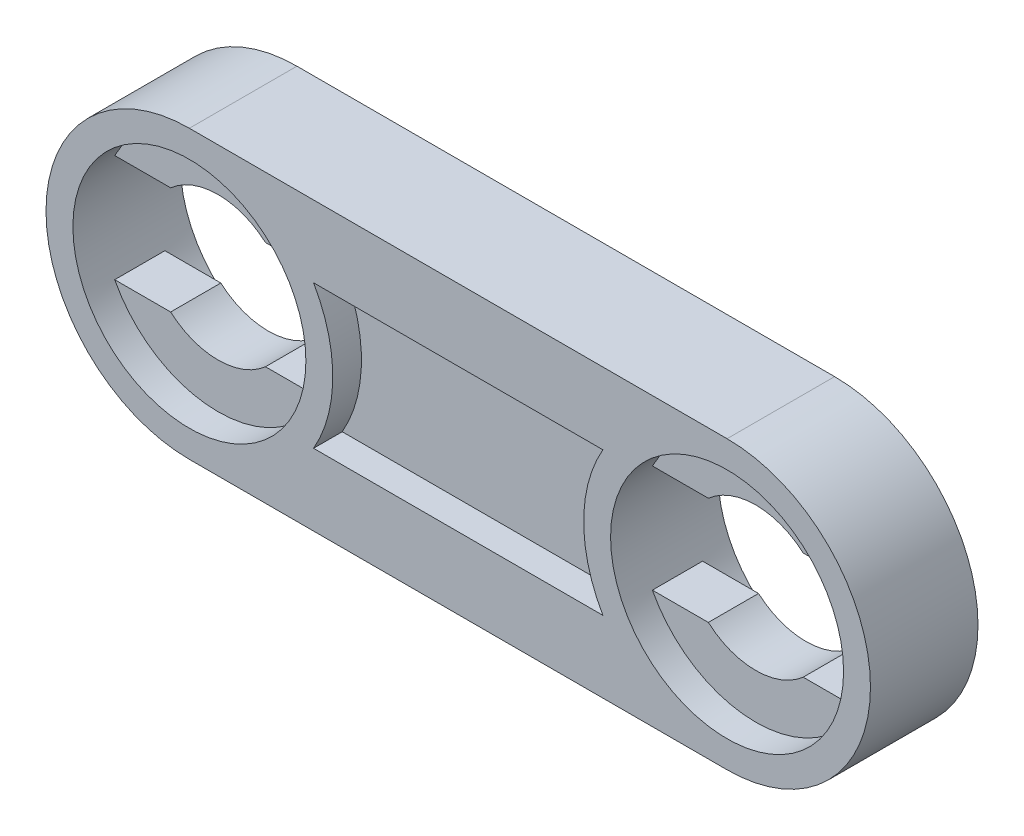
ISO-10303-21;
HEADER;
FILE_DESCRIPTION(('STEP AP214'),'2;1');
FILE_NAME('part.step','',(''),(''),'','','');
FILE_SCHEMA(('AUTOMOTIVE_DESIGN { 1 0 10303 214 1 1 1 1 }'));
ENDSEC;
DATA;
#1=APPLICATION_CONTEXT('core data for automotive mechanical design processes');
#2=APPLICATION_PROTOCOL_DEFINITION('international standard','automotive_design',2000,#1);
#3=PRODUCT_CONTEXT('',#1,'mechanical');
#4=PRODUCT('Part','Part','',(#3));
#5=PRODUCT_RELATED_PRODUCT_CATEGORY('part','',(#4));
#6=PRODUCT_DEFINITION_FORMATION('','',#4);
#7=PRODUCT_DEFINITION_CONTEXT('part definition',#1,'design');
#8=PRODUCT_DEFINITION('design','',#6,#7);
#9=PRODUCT_DEFINITION_SHAPE('','',#8);
#10=(LENGTH_UNIT() NAMED_UNIT(*) SI_UNIT(.MILLI.,.METRE.));
#11=(NAMED_UNIT(*) PLANE_ANGLE_UNIT() SI_UNIT($,.RADIAN.));
#12=(NAMED_UNIT(*) SI_UNIT($,.STERADIAN.) SOLID_ANGLE_UNIT());
#13=UNCERTAINTY_MEASURE_WITH_UNIT(LENGTH_MEASURE(1.E-05),#10,'distance_accuracy_value','');
#14=(GEOMETRIC_REPRESENTATION_CONTEXT(3) GLOBAL_UNCERTAINTY_ASSIGNED_CONTEXT((#13)) GLOBAL_UNIT_ASSIGNED_CONTEXT((#10,
#11,#12)) REPRESENTATION_CONTEXT('',''));
#15=CARTESIAN_POINT('',(0.,0.,0.));
#16=DIRECTION('',(0.,0.,1.));
#17=DIRECTION('',(1.,0.,0.));
#18=AXIS2_PLACEMENT_3D('',#15,#16,#17);
#19=CARTESIAN_POINT('',(0.,0.,0.));
#20=DIRECTION('',(0.,0.,1.));
#21=DIRECTION('',(1.,0.,0.));
#22=AXIS2_PLACEMENT_3D('',#19,#20,#21);
#23=PLANE('',#22);
#24=CARTESIAN_POINT('',(15.,0.,0.));
#25=DIRECTION('',(0.,0.,-1.));
#26=DIRECTION('',(1.,0.,0.));
#27=AXIS2_PLACEMENT_3D('',#24,#25,#26);
#28=CIRCLE('',#27,4.);
#29=CARTESIAN_POINT('',(11.5358983848622,-2.,0.));
#30=VERTEX_POINT('',#29);
#31=CARTESIAN_POINT('',(11.5358983848622,2.,0.));
#32=VERTEX_POINT('',#31);
#33=EDGE_CURVE('E57',#30,#32,#28,.T.);
#34=ORIENTED_EDGE('',*,*,#33,.F.);
#35=DIRECTION('',(1.,0.,0.));
#36=VECTOR('',#35,1.);
#37=CARTESIAN_POINT('',(3.46410161513775,-2.,0.));
#38=LINE('',#37,#36);
#39=CARTESIAN_POINT('',(3.46410161513775,-2.,0.));
#40=VERTEX_POINT('',#39);
#41=EDGE_CURVE('E261',#40,#30,#38,.T.);
#42=ORIENTED_EDGE('',*,*,#41,.F.);
#43=CARTESIAN_POINT('',(0.,0.,0.));
#44=DIRECTION('',(0.,0.,-1.));
#45=DIRECTION('',(1.,0.,0.));
#46=AXIS2_PLACEMENT_3D('',#43,#44,#45);
#47=CIRCLE('',#46,4.);
#48=CARTESIAN_POINT('',(3.46410161513776,2.,0.));
#49=VERTEX_POINT('',#48);
#50=EDGE_CURVE('E275',#49,#40,#47,.T.);
#51=ORIENTED_EDGE('',*,*,#50,.F.);
#52=DIRECTION('',(-1.,0.,0.));
#53=VECTOR('',#52,1.);
#54=CARTESIAN_POINT('',(3.46410161513775,2.,0.));
#55=LINE('',#54,#53);
#56=EDGE_CURVE('E272',#32,#49,#55,.T.);
#57=ORIENTED_EDGE('',*,*,#56,.F.);
#58=EDGE_LOOP('',(#34,#42,#51,#57));
#59=FACE_BOUND('',#58,.T.);
#60=CARTESIAN_POINT('',(0.,0.,0.));
#61=DIRECTION('',(0.,0.,1.));
#62=DIRECTION('',(1.,0.,0.));
#63=AXIS2_PLACEMENT_3D('',#60,#61,#62);
#64=CIRCLE('',#63,4.);
#65=CARTESIAN_POINT('',(0.,4.,0.));
#66=VERTEX_POINT('',#65);
#67=CARTESIAN_POINT('',(0.,-4.,0.));
#68=VERTEX_POINT('',#67);
#69=EDGE_CURVE('E393',#66,#68,#64,.T.);
#70=ORIENTED_EDGE('',*,*,#69,.T.);
#71=DIRECTION('',(1.,0.,0.));
#72=VECTOR('',#71,1.);
#73=CARTESIAN_POINT('',(0.,-4.,0.));
#74=LINE('',#73,#72);
#75=CARTESIAN_POINT('',(15.,-4.,0.));
#76=VERTEX_POINT('',#75);
#77=EDGE_CURVE('E423',#68,#76,#74,.T.);
#78=ORIENTED_EDGE('',*,*,#77,.T.);
#79=CARTESIAN_POINT('',(15.,0.,0.));
#80=DIRECTION('',(0.,0.,1.));
#81=DIRECTION('',(1.,0.,0.));
#82=AXIS2_PLACEMENT_3D('',#79,#80,#81);
#83=CIRCLE('',#82,4.);
#84=CARTESIAN_POINT('',(15.,4.,0.));
#85=VERTEX_POINT('',#84);
#86=EDGE_CURVE('E426',#76,#85,#83,.T.);
#87=ORIENTED_EDGE('',*,*,#86,.T.);
#88=DIRECTION('',(-1.,0.,0.));
#89=VECTOR('',#88,1.);
#90=CARTESIAN_POINT('',(0.,4.,0.));
#91=LINE('',#90,#89);
#92=EDGE_CURVE('E411',#85,#66,#91,.T.);
#93=ORIENTED_EDGE('',*,*,#92,.T.);
#94=EDGE_LOOP('',(#70,#78,#87,#93));
#95=FACE_BOUND('',#94,.T.);
#96=CARTESIAN_POINT('',(0.,0.,0.));
#97=DIRECTION('',(0.,0.,1.));
#98=DIRECTION('',(1.,0.,0.));
#99=AXIS2_PLACEMENT_3D('',#96,#97,#98);
#100=CIRCLE('',#99,3.25);
#101=CARTESIAN_POINT('',(3.25,0.,0.));
#102=VERTEX_POINT('',#101);
#103=EDGE_CURVE('E387',#102,#102,#100,.T.);
#104=ORIENTED_EDGE('',*,*,#103,.F.);
#105=EDGE_LOOP('',(#104));
#106=FACE_BOUND('',#105,.T.);
#107=CARTESIAN_POINT('',(15.,0.,0.));
#108=DIRECTION('',(0.,0.,-1.));
#109=DIRECTION('',(-1.,0.,0.));
#110=AXIS2_PLACEMENT_3D('',#107,#108,#109);
#111=CIRCLE('',#110,3.25);
#112=CARTESIAN_POINT('',(11.75,0.,0.));
#113=VERTEX_POINT('',#112);
#114=EDGE_CURVE('E324',#113,#113,#111,.T.);
#115=ORIENTED_EDGE('',*,*,#114,.T.);
#116=EDGE_LOOP('',(#115));
#117=FACE_BOUND('',#116,.T.);
#118=ADVANCED_FACE('F34',(#59,#95,#106,#117),#23,.T.);
#119=CARTESIAN_POINT('',(17.8831406486677,-1.5,-3.001));
#120=DIRECTION('',(0.,1.,0.));
#121=DIRECTION('',(0.,0.,1.));
#122=AXIS2_PLACEMENT_3D('',#119,#120,#121);
#123=PLANE('',#122);
#124=DIRECTION('',(1.,0.,0.));
#125=VECTOR('',#124,1.);
#126=CARTESIAN_POINT('',(17.8831406486677,-1.5,-2.2));
#127=LINE('',#126,#125);
#128=CARTESIAN_POINT('',(16.3228756555323,-1.5,-2.2));
#129=VERTEX_POINT('',#128);
#130=CARTESIAN_POINT('',(17.8831406486677,-1.5,-2.2));
#131=VERTEX_POINT('',#130);
#132=EDGE_CURVE('E300',#129,#131,#127,.T.);
#133=ORIENTED_EDGE('',*,*,#132,.F.);
#134=DIRECTION('',(0.,0.,1.));
#135=VECTOR('',#134,1.);
#136=CARTESIAN_POINT('',(16.3228756555323,-1.5,-3.001));
#137=LINE('',#136,#135);
#138=CARTESIAN_POINT('',(16.3228756555323,-1.5,-0.8));
#139=VERTEX_POINT('',#138);
#140=EDGE_CURVE('E331',#129,#139,#137,.T.);
#141=ORIENTED_EDGE('',*,*,#140,.T.);
#142=DIRECTION('',(1.,0.,0.));
#143=VECTOR('',#142,1.);
#144=CARTESIAN_POINT('',(17.8831406486677,-1.5,-0.8));
#145=LINE('',#144,#143);
#146=CARTESIAN_POINT('',(17.8831406486677,-1.5,-0.8));
#147=VERTEX_POINT('',#146);
#148=EDGE_CURVE('E318',#139,#147,#145,.T.);
#149=ORIENTED_EDGE('',*,*,#148,.T.);
#150=DIRECTION('',(0.,0.,1.));
#151=VECTOR('',#150,1.);
#152=CARTESIAN_POINT('',(17.8831406486677,-1.5,-3.001));
#153=LINE('',#152,#151);
#154=EDGE_CURVE('E328',#131,#147,#153,.T.);
#155=ORIENTED_EDGE('',*,*,#154,.F.);
#156=EDGE_LOOP('',(#133,#141,#149,#155));
#157=FACE_BOUND('',#156,.T.);
#158=ADVANCED_FACE('F476',(#157),#123,.T.);
#159=CARTESIAN_POINT('',(15.,0.,-3.001));
#160=DIRECTION('',(0.,0.,1.));
#161=DIRECTION('',(1.,0.,0.));
#162=AXIS2_PLACEMENT_3D('',#159,#160,#161);
#163=CYLINDRICAL_SURFACE('',#162,2.);
#164=CARTESIAN_POINT('',(15.,0.,-2.2));
#165=DIRECTION('',(0.,0.,1.));
#166=DIRECTION('',(1.,0.,0.));
#167=AXIS2_PLACEMENT_3D('',#164,#165,#166);
#168=CIRCLE('',#167,2.);
#169=CARTESIAN_POINT('',(13.6771243444677,-1.5,-2.2));
#170=VERTEX_POINT('',#169);
#171=EDGE_CURVE('E298',#170,#129,#168,.T.);
#172=ORIENTED_EDGE('',*,*,#171,.F.);
#173=DIRECTION('',(0.,0.,1.));
#174=VECTOR('',#173,1.);
#175=CARTESIAN_POINT('',(13.6771243444677,-1.5,-3.001));
#176=LINE('',#175,#174);
#177=CARTESIAN_POINT('',(13.6771243444677,-1.5,-0.800000000000001));
#178=VERTEX_POINT('',#177);
#179=EDGE_CURVE('E333',#170,#178,#176,.T.);
#180=ORIENTED_EDGE('',*,*,#179,.T.);
#181=CARTESIAN_POINT('',(15.,0.,-0.8));
#182=DIRECTION('',(0.,0.,1.));
#183=DIRECTION('',(1.,0.,0.));
#184=AXIS2_PLACEMENT_3D('',#181,#182,#183);
#185=CIRCLE('',#184,2.);
#186=EDGE_CURVE('E315',#178,#139,#185,.T.);
#187=ORIENTED_EDGE('',*,*,#186,.T.);
#188=ORIENTED_EDGE('',*,*,#140,.F.);
#189=EDGE_LOOP('',(#172,#180,#187,#188));
#190=FACE_BOUND('',#189,.T.);
#191=ADVANCED_FACE('F482',(#190),#163,.F.);
#192=CARTESIAN_POINT('',(13.6771243444677,-1.5,-3.001));
#193=DIRECTION('',(0.,1.,0.));
#194=DIRECTION('',(0.,0.,1.));
#195=AXIS2_PLACEMENT_3D('',#192,#193,#194);
#196=PLANE('',#195);
#197=DIRECTION('',(1.,0.,0.));
#198=VECTOR('',#197,1.);
#199=CARTESIAN_POINT('',(13.6771243444677,-1.5,-2.2));
#200=LINE('',#199,#198);
#201=CARTESIAN_POINT('',(12.1168593513323,-1.5,-2.2));
#202=VERTEX_POINT('',#201);
#203=EDGE_CURVE('E296',#202,#170,#200,.T.);
#204=ORIENTED_EDGE('',*,*,#203,.F.);
#205=DIRECTION('',(0.,0.,1.));
#206=VECTOR('',#205,1.);
#207=CARTESIAN_POINT('',(12.1168593513323,-1.5,-3.001));
#208=LINE('',#207,#206);
#209=CARTESIAN_POINT('',(12.1168593513323,-1.5,-0.8));
#210=VERTEX_POINT('',#209);
#211=EDGE_CURVE('E335',#202,#210,#208,.T.);
#212=ORIENTED_EDGE('',*,*,#211,.T.);
#213=DIRECTION('',(1.,0.,0.));
#214=VECTOR('',#213,1.);
#215=CARTESIAN_POINT('',(13.6771243444677,-1.5,-0.8));
#216=LINE('',#215,#214);
#217=EDGE_CURVE('E312',#210,#178,#216,.T.);
#218=ORIENTED_EDGE('',*,*,#217,.T.);
#219=ORIENTED_EDGE('',*,*,#179,.F.);
#220=EDGE_LOOP('',(#204,#212,#218,#219));
#221=FACE_BOUND('',#220,.T.);
#222=ADVANCED_FACE('F586',(#221),#196,.T.);
#223=CARTESIAN_POINT('',(13.6771243444677,1.5,-3.001));
#224=DIRECTION('',(0.,-1.,0.));
#225=DIRECTION('',(0.,0.,-1.));
#226=AXIS2_PLACEMENT_3D('',#223,#224,#225);
#227=PLANE('',#226);
#228=DIRECTION('',(-1.,0.,0.));
#229=VECTOR('',#228,1.);
#230=CARTESIAN_POINT('',(13.6771243444677,1.5,-2.2));
#231=LINE('',#230,#229);
#232=CARTESIAN_POINT('',(13.6771243444677,1.5,-2.2));
#233=VERTEX_POINT('',#232);
#234=CARTESIAN_POINT('',(12.1168593513323,1.5,-2.2));
#235=VERTEX_POINT('',#234);
#236=EDGE_CURVE('E294',#233,#235,#231,.T.);
#237=ORIENTED_EDGE('',*,*,#236,.F.);
#238=DIRECTION('',(0.,0.,1.));
#239=VECTOR('',#238,1.);
#240=CARTESIAN_POINT('',(13.6771243444677,1.5,-3.001));
#241=LINE('',#240,#239);
#242=CARTESIAN_POINT('',(13.6771243444677,1.5,-0.8));
#243=VERTEX_POINT('',#242);
#244=EDGE_CURVE('E339',#233,#243,#241,.T.);
#245=ORIENTED_EDGE('',*,*,#244,.T.);
#246=DIRECTION('',(-1.,0.,0.));
#247=VECTOR('',#246,1.);
#248=CARTESIAN_POINT('',(13.6771243444677,1.5,-0.8));
#249=LINE('',#248,#247);
#250=CARTESIAN_POINT('',(12.1168593513323,1.5,-0.8));
#251=VERTEX_POINT('',#250);
#252=EDGE_CURVE('E309',#243,#251,#249,.T.);
#253=ORIENTED_EDGE('',*,*,#252,.T.);
#254=DIRECTION('',(0.,0.,1.));
#255=VECTOR('',#254,1.);
#256=CARTESIAN_POINT('',(12.1168593513323,1.5,-3.001));
#257=LINE('',#256,#255);
#258=EDGE_CURVE('E337',#235,#251,#257,.T.);
#259=ORIENTED_EDGE('',*,*,#258,.F.);
#260=EDGE_LOOP('',(#237,#245,#253,#259));
#261=FACE_BOUND('',#260,.T.);
#262=ADVANCED_FACE('F590',(#261),#227,.T.);
#263=CARTESIAN_POINT('',(15.,0.,-3.001));
#264=DIRECTION('',(0.,0.,1.));
#265=DIRECTION('',(1.,0.,0.));
#266=AXIS2_PLACEMENT_3D('',#263,#264,#265);
#267=CYLINDRICAL_SURFACE('',#266,2.);
#268=CARTESIAN_POINT('',(15.,0.,-2.2));
#269=DIRECTION('',(0.,0.,1.));
#270=DIRECTION('',(1.,0.,0.));
#271=AXIS2_PLACEMENT_3D('',#268,#269,#270);
#272=CIRCLE('',#271,2.);
#273=CARTESIAN_POINT('',(16.3228756555323,1.5,-2.2));
#274=VERTEX_POINT('',#273);
#275=EDGE_CURVE('E292',#274,#233,#272,.T.);
#276=ORIENTED_EDGE('',*,*,#275,.F.);
#277=DIRECTION('',(0.,0.,1.));
#278=VECTOR('',#277,1.);
#279=CARTESIAN_POINT('',(16.3228756555323,1.5,-3.001));
#280=LINE('',#279,#278);
#281=CARTESIAN_POINT('',(16.3228756555323,1.5,-0.800000000000001));
#282=VERTEX_POINT('',#281);
#283=EDGE_CURVE('E341',#274,#282,#280,.T.);
#284=ORIENTED_EDGE('',*,*,#283,.T.);
#285=CARTESIAN_POINT('',(15.,0.,-0.8));
#286=DIRECTION('',(0.,0.,1.));
#287=DIRECTION('',(1.,0.,0.));
#288=AXIS2_PLACEMENT_3D('',#285,#286,#287);
#289=CIRCLE('',#288,2.);
#290=EDGE_CURVE('E306',#282,#243,#289,.T.);
#291=ORIENTED_EDGE('',*,*,#290,.T.);
#292=ORIENTED_EDGE('',*,*,#244,.F.);
#293=EDGE_LOOP('',(#276,#284,#291,#292));
#294=FACE_BOUND('',#293,.T.);
#295=ADVANCED_FACE('F532',(#294),#267,.F.);
#296=CARTESIAN_POINT('',(17.8831406486677,1.5,-3.001));
#297=DIRECTION('',(0.,-1.,0.));
#298=DIRECTION('',(0.,0.,-1.));
#299=AXIS2_PLACEMENT_3D('',#296,#297,#298);
#300=PLANE('',#299);
#301=DIRECTION('',(-1.,0.,0.));
#302=VECTOR('',#301,1.);
#303=CARTESIAN_POINT('',(17.8831406486677,1.5,-2.2));
#304=LINE('',#303,#302);
#305=CARTESIAN_POINT('',(17.8831406486677,1.5,-2.2));
#306=VERTEX_POINT('',#305);
#307=EDGE_CURVE('E290',#306,#274,#304,.T.);
#308=ORIENTED_EDGE('',*,*,#307,.F.);
#309=DIRECTION('',(0.,0.,1.));
#310=VECTOR('',#309,1.);
#311=CARTESIAN_POINT('',(17.8831406486677,1.5,-3.001));
#312=LINE('',#311,#310);
#313=CARTESIAN_POINT('',(17.8831406486677,1.5,-0.8));
#314=VERTEX_POINT('',#313);
#315=EDGE_CURVE('E327',#306,#314,#312,.T.);
#316=ORIENTED_EDGE('',*,*,#315,.T.);
#317=DIRECTION('',(-1.,0.,0.));
#318=VECTOR('',#317,1.);
#319=CARTESIAN_POINT('',(17.8831406486677,1.5,-0.8));
#320=LINE('',#319,#318);
#321=EDGE_CURVE('E11',#314,#282,#320,.T.);
#322=ORIENTED_EDGE('',*,*,#321,.T.);
#323=ORIENTED_EDGE('',*,*,#283,.F.);
#324=EDGE_LOOP('',(#308,#316,#322,#323));
#325=FACE_BOUND('',#324,.T.);
#326=ADVANCED_FACE('F518',(#325),#300,.T.);
#327=CARTESIAN_POINT('',(0.,0.,-3.));
#328=DIRECTION('',(0.,0.,1.));
#329=DIRECTION('',(1.,0.,0.));
#330=AXIS2_PLACEMENT_3D('',#327,#328,#329);
#331=PLANE('',#330);
#332=DIRECTION('',(-1.,0.,0.));
#333=VECTOR('',#332,1.);
#334=CARTESIAN_POINT('',(11.,-2.,-3.));
#335=LINE('',#334,#333);
#336=CARTESIAN_POINT('',(11.,-2.,-3.));
#337=VERTEX_POINT('',#336);
#338=CARTESIAN_POINT('',(4.,-2.,-3.));
#339=VERTEX_POINT('',#338);
#340=EDGE_CURVE('E248',#337,#339,#335,.T.);
#341=ORIENTED_EDGE('',*,*,#340,.F.);
#342=DIRECTION('',(0.,-1.,0.));
#343=VECTOR('',#342,1.);
#344=CARTESIAN_POINT('',(11.,-2.,-3.));
#345=LINE('',#344,#343);
#346=CARTESIAN_POINT('',(11.,2.,-3.));
#347=VERTEX_POINT('',#346);
#348=EDGE_CURVE('E49',#347,#337,#345,.T.);
#349=ORIENTED_EDGE('',*,*,#348,.F.);
#350=DIRECTION('',(1.,0.,0.));
#351=VECTOR('',#350,1.);
#352=CARTESIAN_POINT('',(11.,2.,-3.));
#353=LINE('',#352,#351);
#354=CARTESIAN_POINT('',(4.,2.,-3.));
#355=VERTEX_POINT('',#354);
#356=EDGE_CURVE('E239',#355,#347,#353,.T.);
#357=ORIENTED_EDGE('',*,*,#356,.F.);
#358=DIRECTION('',(0.,1.,0.));
#359=VECTOR('',#358,1.);
#360=CARTESIAN_POINT('',(4.,-2.,-3.));
#361=LINE('',#360,#359);
#362=EDGE_CURVE('E242',#339,#355,#361,.T.);
#363=ORIENTED_EDGE('',*,*,#362,.F.);
#364=EDGE_LOOP('',(#341,#349,#357,#363));
#365=FACE_BOUND('',#364,.T.);
#366=CARTESIAN_POINT('',(0.,0.,-3.));
#367=DIRECTION('',(0.,0.,1.));
#368=DIRECTION('',(1.,0.,0.));
#369=AXIS2_PLACEMENT_3D('',#366,#367,#368);
#370=CIRCLE('',#369,3.25);
#371=CARTESIAN_POINT('',(3.25,0.,-3.));
#372=VERTEX_POINT('',#371);
#373=EDGE_CURVE('E384',#372,#372,#370,.F.);
#374=ORIENTED_EDGE('',*,*,#373,.F.);
#375=EDGE_LOOP('',(#374));
#376=FACE_BOUND('',#375,.T.);
#377=CARTESIAN_POINT('',(0.,0.,-3.));
#378=DIRECTION('',(0.,0.,1.));
#379=DIRECTION('',(1.,0.,0.));
#380=AXIS2_PLACEMENT_3D('',#377,#378,#379);
#381=CIRCLE('',#380,4.);
#382=CARTESIAN_POINT('',(0.,4.,-3.));
#383=VERTEX_POINT('',#382);
#384=CARTESIAN_POINT('',(0.,-4.,-3.));
#385=VERTEX_POINT('',#384);
#386=EDGE_CURVE('E407',#383,#385,#381,.T.);
#387=ORIENTED_EDGE('',*,*,#386,.F.);
#388=DIRECTION('',(-1.,0.,0.));
#389=VECTOR('',#388,1.);
#390=CARTESIAN_POINT('',(0.,4.,-3.));
#391=LINE('',#390,#389);
#392=CARTESIAN_POINT('',(15.,4.,-3.));
#393=VERTEX_POINT('',#392);
#394=EDGE_CURVE('E417',#393,#383,#391,.T.);
#395=ORIENTED_EDGE('',*,*,#394,.F.);
#396=CARTESIAN_POINT('',(15.,0.,-3.));
#397=DIRECTION('',(0.,0.,1.));
#398=DIRECTION('',(1.,0.,0.));
#399=AXIS2_PLACEMENT_3D('',#396,#397,#398);
#400=CIRCLE('',#399,4.);
#401=CARTESIAN_POINT('',(15.,-4.,-3.));
#402=VERTEX_POINT('',#401);
#403=EDGE_CURVE('E414',#402,#393,#400,.T.);
#404=ORIENTED_EDGE('',*,*,#403,.F.);
#405=DIRECTION('',(1.,0.,0.));
#406=VECTOR('',#405,1.);
#407=CARTESIAN_POINT('',(0.,-4.,-3.));
#408=LINE('',#407,#406);
#409=EDGE_CURVE('E410',#385,#402,#408,.T.);
#410=ORIENTED_EDGE('',*,*,#409,.F.);
#411=EDGE_LOOP('',(#387,#395,#404,#410));
#412=FACE_BOUND('',#411,.T.);
#413=CARTESIAN_POINT('',(15.,0.,-3.));
#414=DIRECTION('',(0.,0.,1.));
#415=DIRECTION('',(1.,0.,0.));
#416=AXIS2_PLACEMENT_3D('',#413,#414,#415);
#417=CIRCLE('',#416,3.25);
#418=CARTESIAN_POINT('',(18.25,0.,-3.));
#419=VERTEX_POINT('',#418);
#420=EDGE_CURVE('E321',#419,#419,#417,.T.);
#421=ORIENTED_EDGE('',*,*,#420,.T.);
#422=EDGE_LOOP('',(#421));
#423=FACE_BOUND('',#422,.T.);
#424=ADVANCED_FACE('F488',(#365,#376,#412,#423),#331,.F.);
#425=CARTESIAN_POINT('',(-2.8831406486677,1.5,-3.001));
#426=DIRECTION('',(0.,1.,0.));
#427=DIRECTION('',(0.,0.,1.));
#428=AXIS2_PLACEMENT_3D('',#425,#426,#427);
#429=PLANE('',#428);
#430=DIRECTION('',(0.,0.,1.));
#431=VECTOR('',#430,1.);
#432=CARTESIAN_POINT('',(-2.8831406486677,1.5,-3.001));
#433=LINE('',#432,#431);
#434=CARTESIAN_POINT('',(-2.8831406486677,1.5,-2.2));
#435=VERTEX_POINT('',#434);
#436=CARTESIAN_POINT('',(-2.8831406486677,1.5,-0.8));
#437=VERTEX_POINT('',#436);
#438=EDGE_CURVE('E391',#435,#437,#433,.T.);
#439=ORIENTED_EDGE('',*,*,#438,.F.);
#440=DIRECTION('',(1.,0.,0.));
#441=VECTOR('',#440,1.);
#442=CARTESIAN_POINT('',(-2.8831406486677,1.5,-2.2));
#443=LINE('',#442,#441);
#444=CARTESIAN_POINT('',(-1.3228756555323,1.5,-2.2));
#445=VERTEX_POINT('',#444);
#446=EDGE_CURVE('E362',#435,#445,#443,.T.);
#447=ORIENTED_EDGE('',*,*,#446,.T.);
#448=DIRECTION('',(0.,0.,1.));
#449=VECTOR('',#448,1.);
#450=CARTESIAN_POINT('',(-1.3228756555323,1.5,-3.001));
#451=LINE('',#450,#449);
#452=CARTESIAN_POINT('',(-1.3228756555323,1.5,-0.8));
#453=VERTEX_POINT('',#452);
#454=EDGE_CURVE('E394',#445,#453,#451,.T.);
#455=ORIENTED_EDGE('',*,*,#454,.T.);
#456=DIRECTION('',(1.,0.,0.));
#457=VECTOR('',#456,1.);
#458=CARTESIAN_POINT('',(-2.8831406486677,1.5,-0.8));
#459=LINE('',#458,#457);
#460=EDGE_CURVE('E381',#437,#453,#459,.T.);
#461=ORIENTED_EDGE('',*,*,#460,.F.);
#462=EDGE_LOOP('',(#439,#447,#455,#461));
#463=FACE_BOUND('',#462,.T.);
#464=ADVANCED_FACE('F517',(#463),#429,.F.);
#465=CARTESIAN_POINT('',(0.,0.,-3.001));
#466=DIRECTION('',(0.,0.,1.));
#467=DIRECTION('',(1.,0.,0.));
#468=AXIS2_PLACEMENT_3D('',#465,#466,#467);
#469=CYLINDRICAL_SURFACE('',#468,2.);
#470=ORIENTED_EDGE('',*,*,#454,.F.);
#471=CARTESIAN_POINT('',(0.,0.,-2.2));
#472=DIRECTION('',(0.,0.,1.));
#473=DIRECTION('',(1.,0.,0.));
#474=AXIS2_PLACEMENT_3D('',#471,#472,#473);
#475=CIRCLE('',#474,2.);
#476=CARTESIAN_POINT('',(1.3228756555323,1.5,-2.2));
#477=VERTEX_POINT('',#476);
#478=EDGE_CURVE('E359',#445,#477,#475,.F.);
#479=ORIENTED_EDGE('',*,*,#478,.T.);
#480=DIRECTION('',(0.,0.,1.));
#481=VECTOR('',#480,1.);
#482=CARTESIAN_POINT('',(1.3228756555323,1.5,-3.001));
#483=LINE('',#482,#481);
#484=CARTESIAN_POINT('',(1.3228756555323,1.5,-0.800000000000001));
#485=VERTEX_POINT('',#484);
#486=EDGE_CURVE('E396',#477,#485,#483,.T.);
#487=ORIENTED_EDGE('',*,*,#486,.T.);
#488=CARTESIAN_POINT('',(0.,0.,-0.8));
#489=DIRECTION('',(0.,0.,1.));
#490=DIRECTION('',(1.,0.,0.));
#491=AXIS2_PLACEMENT_3D('',#488,#489,#490);
#492=CIRCLE('',#491,2.);
#493=EDGE_CURVE('E378',#453,#485,#492,.F.);
#494=ORIENTED_EDGE('',*,*,#493,.F.);
#495=EDGE_LOOP('',(#470,#479,#487,#494));
#496=FACE_BOUND('',#495,.T.);
#497=ADVANCED_FACE('F529',(#496),#469,.F.);
#498=CARTESIAN_POINT('',(1.3228756555323,1.5,-3.001));
#499=DIRECTION('',(0.,1.,0.));
#500=DIRECTION('',(0.,0.,1.));
#501=AXIS2_PLACEMENT_3D('',#498,#499,#500);
#502=PLANE('',#501);
#503=ORIENTED_EDGE('',*,*,#486,.F.);
#504=DIRECTION('',(1.,0.,0.));
#505=VECTOR('',#504,1.);
#506=CARTESIAN_POINT('',(1.3228756555323,1.5,-2.2));
#507=LINE('',#506,#505);
#508=CARTESIAN_POINT('',(2.8831406486677,1.5,-2.2));
#509=VERTEX_POINT('',#508);
#510=EDGE_CURVE('E356',#477,#509,#507,.T.);
#511=ORIENTED_EDGE('',*,*,#510,.T.);
#512=DIRECTION('',(0.,0.,1.));
#513=VECTOR('',#512,1.);
#514=CARTESIAN_POINT('',(2.8831406486677,1.5,-3.001));
#515=LINE('',#514,#513);
#516=CARTESIAN_POINT('',(2.8831406486677,1.5,-0.8));
#517=VERTEX_POINT('',#516);
#518=EDGE_CURVE('E398',#509,#517,#515,.T.);
#519=ORIENTED_EDGE('',*,*,#518,.T.);
#520=DIRECTION('',(1.,0.,0.));
#521=VECTOR('',#520,1.);
#522=CARTESIAN_POINT('',(1.3228756555323,1.5,-0.8));
#523=LINE('',#522,#521);
#524=EDGE_CURVE('E375',#485,#517,#523,.T.);
#525=ORIENTED_EDGE('',*,*,#524,.F.);
#526=EDGE_LOOP('',(#503,#511,#519,#525));
#527=FACE_BOUND('',#526,.T.);
#528=ADVANCED_FACE('F807',(#527),#502,.F.);
#529=CARTESIAN_POINT('',(1.3228756555323,-1.5,-3.001));
#530=DIRECTION('',(0.,-1.,0.));
#531=DIRECTION('',(0.,0.,-1.));
#532=AXIS2_PLACEMENT_3D('',#529,#530,#531);
#533=PLANE('',#532);
#534=DIRECTION('',(0.,0.,1.));
#535=VECTOR('',#534,1.);
#536=CARTESIAN_POINT('',(2.8831406486677,-1.5,-3.001));
#537=LINE('',#536,#535);
#538=CARTESIAN_POINT('',(2.8831406486677,-1.5,-2.2));
#539=VERTEX_POINT('',#538);
#540=CARTESIAN_POINT('',(2.8831406486677,-1.5,-0.8));
#541=VERTEX_POINT('',#540);
#542=EDGE_CURVE('E400',#539,#541,#537,.T.);
#543=ORIENTED_EDGE('',*,*,#542,.F.);
#544=DIRECTION('',(-1.,0.,0.));
#545=VECTOR('',#544,1.);
#546=CARTESIAN_POINT('',(1.3228756555323,-1.5,-2.2));
#547=LINE('',#546,#545);
#548=CARTESIAN_POINT('',(1.32287565553229,-1.5,-2.2));
#549=VERTEX_POINT('',#548);
#550=EDGE_CURVE('E353',#539,#549,#547,.T.);
#551=ORIENTED_EDGE('',*,*,#550,.T.);
#552=DIRECTION('',(0.,0.,1.));
#553=VECTOR('',#552,1.);
#554=CARTESIAN_POINT('',(1.32287565553229,-1.5,-3.001));
#555=LINE('',#554,#553);
#556=CARTESIAN_POINT('',(1.32287565553229,-1.5,-0.8));
#557=VERTEX_POINT('',#556);
#558=EDGE_CURVE('E402',#549,#557,#555,.T.);
#559=ORIENTED_EDGE('',*,*,#558,.T.);
#560=DIRECTION('',(-1.,0.,0.));
#561=VECTOR('',#560,1.);
#562=CARTESIAN_POINT('',(1.3228756555323,-1.5,-0.8));
#563=LINE('',#562,#561);
#564=EDGE_CURVE('E372',#541,#557,#563,.T.);
#565=ORIENTED_EDGE('',*,*,#564,.F.);
#566=EDGE_LOOP('',(#543,#551,#559,#565));
#567=FACE_BOUND('',#566,.T.);
#568=ADVANCED_FACE('F454',(#567),#533,.F.);
#569=CARTESIAN_POINT('',(0.,0.,-3.001));
#570=DIRECTION('',(0.,0.,1.));
#571=DIRECTION('',(1.,0.,0.));
#572=AXIS2_PLACEMENT_3D('',#569,#570,#571);
#573=CYLINDRICAL_SURFACE('',#572,2.);
#574=ORIENTED_EDGE('',*,*,#558,.F.);
#575=CARTESIAN_POINT('',(0.,0.,-2.2));
#576=DIRECTION('',(0.,0.,1.));
#577=DIRECTION('',(1.,0.,0.));
#578=AXIS2_PLACEMENT_3D('',#575,#576,#577);
#579=CIRCLE('',#578,2.);
#580=CARTESIAN_POINT('',(-1.3228756555323,-1.5,-2.2));
#581=VERTEX_POINT('',#580);
#582=EDGE_CURVE('E350',#549,#581,#579,.F.);
#583=ORIENTED_EDGE('',*,*,#582,.T.);
#584=DIRECTION('',(0.,0.,1.));
#585=VECTOR('',#584,1.);
#586=CARTESIAN_POINT('',(-1.3228756555323,-1.5,-3.001));
#587=LINE('',#586,#585);
#588=CARTESIAN_POINT('',(-1.3228756555323,-1.5,-0.800000000000001));
#589=VERTEX_POINT('',#588);
#590=EDGE_CURVE('E404',#581,#589,#587,.T.);
#591=ORIENTED_EDGE('',*,*,#590,.T.);
#592=CARTESIAN_POINT('',(0.,0.,-0.8));
#593=DIRECTION('',(0.,0.,1.));
#594=DIRECTION('',(1.,0.,0.));
#595=AXIS2_PLACEMENT_3D('',#592,#593,#594);
#596=CIRCLE('',#595,2.);
#597=EDGE_CURVE('E369',#557,#589,#596,.F.);
#598=ORIENTED_EDGE('',*,*,#597,.F.);
#599=EDGE_LOOP('',(#574,#583,#591,#598));
#600=FACE_BOUND('',#599,.T.);
#601=ADVANCED_FACE('F457',(#600),#573,.F.);
#602=CARTESIAN_POINT('',(-2.8831406486677,-1.5,-3.001));
#603=DIRECTION('',(0.,-1.,0.));
#604=DIRECTION('',(0.,0.,-1.));
#605=AXIS2_PLACEMENT_3D('',#602,#603,#604);
#606=PLANE('',#605);
#607=ORIENTED_EDGE('',*,*,#590,.F.);
#608=DIRECTION('',(-1.,0.,0.));
#609=VECTOR('',#608,1.);
#610=CARTESIAN_POINT('',(-2.8831406486677,-1.5,-2.2));
#611=LINE('',#610,#609);
#612=CARTESIAN_POINT('',(-2.8831406486677,-1.5,-2.2));
#613=VERTEX_POINT('',#612);
#614=EDGE_CURVE('E347',#581,#613,#611,.T.);
#615=ORIENTED_EDGE('',*,*,#614,.T.);
#616=DIRECTION('',(0.,0.,1.));
#617=VECTOR('',#616,1.);
#618=CARTESIAN_POINT('',(-2.8831406486677,-1.5,-3.001));
#619=LINE('',#618,#617);
#620=CARTESIAN_POINT('',(-2.8831406486677,-1.5,-0.8));
#621=VERTEX_POINT('',#620);
#622=EDGE_CURVE('E390',#613,#621,#619,.T.);
#623=ORIENTED_EDGE('',*,*,#622,.T.);
#624=DIRECTION('',(-1.,0.,0.));
#625=VECTOR('',#624,1.);
#626=CARTESIAN_POINT('',(-2.8831406486677,-1.5,-0.8));
#627=LINE('',#626,#625);
#628=EDGE_CURVE('E42',#589,#621,#627,.T.);
#629=ORIENTED_EDGE('',*,*,#628,.F.);
#630=EDGE_LOOP('',(#607,#615,#623,#629));
#631=FACE_BOUND('',#630,.T.);
#632=ADVANCED_FACE('F458',(#631),#606,.F.);
#633=CARTESIAN_POINT('',(0.,0.,-3.));
#634=DIRECTION('',(0.,0.,1.));
#635=DIRECTION('',(1.,0.,0.));
#636=AXIS2_PLACEMENT_3D('',#633,#634,#635);
#637=CYLINDRICAL_SURFACE('',#636,4.);
#638=ORIENTED_EDGE('',*,*,#69,.F.);
#639=DIRECTION('',(0.,0.,1.));
#640=VECTOR('',#639,1.);
#641=CARTESIAN_POINT('',(0.,4.,-3.));
#642=LINE('',#641,#640);
#643=EDGE_CURVE('E431',#383,#66,#642,.T.);
#644=ORIENTED_EDGE('',*,*,#643,.F.);
#645=ORIENTED_EDGE('',*,*,#386,.T.);
#646=DIRECTION('',(0.,0.,1.));
#647=VECTOR('',#646,1.);
#648=CARTESIAN_POINT('',(0.,-4.,-3.));
#649=LINE('',#648,#647);
#650=EDGE_CURVE('E420',#385,#68,#649,.T.);
#651=ORIENTED_EDGE('',*,*,#650,.T.);
#652=EDGE_LOOP('',(#638,#644,#645,#651));
#653=FACE_BOUND('',#652,.T.);
#654=ADVANCED_FACE('F36',(#653),#637,.T.);
#655=CARTESIAN_POINT('',(0.,4.,-3.));
#656=DIRECTION('',(0.,1.,0.));
#657=DIRECTION('',(0.,0.,1.));
#658=AXIS2_PLACEMENT_3D('',#655,#656,#657);
#659=PLANE('',#658);
#660=ORIENTED_EDGE('',*,*,#92,.F.);
#661=DIRECTION('',(0.,0.,1.));
#662=VECTOR('',#661,1.);
#663=CARTESIAN_POINT('',(15.,4.,-3.));
#664=LINE('',#663,#662);
#665=EDGE_CURVE('E433',#393,#85,#664,.T.);
#666=ORIENTED_EDGE('',*,*,#665,.F.);
#667=ORIENTED_EDGE('',*,*,#394,.T.);
#668=ORIENTED_EDGE('',*,*,#643,.T.);
#669=EDGE_LOOP('',(#660,#666,#667,#668));
#670=FACE_BOUND('',#669,.T.);
#671=ADVANCED_FACE('F490',(#670),#659,.T.);
#672=CARTESIAN_POINT('',(15.,0.,-3.));
#673=DIRECTION('',(0.,0.,1.));
#674=DIRECTION('',(1.,0.,0.));
#675=AXIS2_PLACEMENT_3D('',#672,#673,#674);
#676=CYLINDRICAL_SURFACE('',#675,4.);
#677=ORIENTED_EDGE('',*,*,#86,.F.);
#678=DIRECTION('',(0.,0.,1.));
#679=VECTOR('',#678,1.);
#680=CARTESIAN_POINT('',(15.,-4.,-3.));
#681=LINE('',#680,#679);
#682=EDGE_CURVE('E435',#402,#76,#681,.T.);
#683=ORIENTED_EDGE('',*,*,#682,.F.);
#684=ORIENTED_EDGE('',*,*,#403,.T.);
#685=ORIENTED_EDGE('',*,*,#665,.T.);
#686=EDGE_LOOP('',(#677,#683,#684,#685));
#687=FACE_BOUND('',#686,.T.);
#688=ADVANCED_FACE('F493',(#687),#676,.T.);
#689=CARTESIAN_POINT('',(0.,-4.,-3.));
#690=DIRECTION('',(0.,-1.,0.));
#691=DIRECTION('',(0.,0.,-1.));
#692=AXIS2_PLACEMENT_3D('',#689,#690,#691);
#693=PLANE('',#692);
#694=ORIENTED_EDGE('',*,*,#77,.F.);
#695=ORIENTED_EDGE('',*,*,#650,.F.);
#696=ORIENTED_EDGE('',*,*,#409,.T.);
#697=ORIENTED_EDGE('',*,*,#682,.T.);
#698=EDGE_LOOP('',(#694,#695,#696,#697));
#699=FACE_BOUND('',#698,.T.);
#700=ADVANCED_FACE('F496',(#699),#693,.T.);
#701=CARTESIAN_POINT('',(0.,0.,-3.001));
#702=DIRECTION('',(0.,0.,1.));
#703=DIRECTION('',(1.,0.,0.));
#704=AXIS2_PLACEMENT_3D('',#701,#702,#703);
#705=CYLINDRICAL_SURFACE('',#704,3.25);
#706=CARTESIAN_POINT('',(0.,0.,-2.2));
#707=DIRECTION('',(0.,0.,1.));
#708=DIRECTION('',(1.,0.,0.));
#709=AXIS2_PLACEMENT_3D('',#706,#707,#708);
#710=CIRCLE('',#709,3.25);
#711=EDGE_CURVE('E344',#509,#435,#710,.T.);
#712=ORIENTED_EDGE('',*,*,#711,.T.);
#713=ORIENTED_EDGE('',*,*,#438,.T.);
#714=CARTESIAN_POINT('',(0.,0.,-0.8));
#715=DIRECTION('',(0.,0.,1.));
#716=DIRECTION('',(1.,0.,0.));
#717=AXIS2_PLACEMENT_3D('',#714,#715,#716);
#718=CIRCLE('',#717,3.25);
#719=EDGE_CURVE('E366',#517,#437,#718,.T.);
#720=ORIENTED_EDGE('',*,*,#719,.F.);
#721=ORIENTED_EDGE('',*,*,#518,.F.);
#722=EDGE_LOOP('',(#712,#713,#720,#721));
#723=FACE_BOUND('',#722,.T.);
#724=EDGE_CURVE('E330',#613,#539,#710,.T.);
#725=ORIENTED_EDGE('',*,*,#724,.T.);
#726=ORIENTED_EDGE('',*,*,#542,.T.);
#727=EDGE_CURVE('E365',#621,#541,#718,.T.);
#728=ORIENTED_EDGE('',*,*,#727,.F.);
#729=ORIENTED_EDGE('',*,*,#622,.F.);
#730=EDGE_LOOP('',(#725,#726,#728,#729));
#731=FACE_BOUND('',#730,.T.);
#732=ORIENTED_EDGE('',*,*,#103,.T.);
#733=EDGE_LOOP('',(#732));
#734=FACE_BOUND('',#733,.T.);
#735=ORIENTED_EDGE('',*,*,#373,.T.);
#736=EDGE_LOOP('',(#735));
#737=FACE_BOUND('',#736,.T.);
#738=ADVANCED_FACE('F450',(#723,#731,#734,#737),#705,.F.);
#739=CARTESIAN_POINT('',(0.,0.,-0.8));
#740=DIRECTION('',(0.,0.,1.));
#741=DIRECTION('',(1.,0.,0.));
#742=AXIS2_PLACEMENT_3D('',#739,#740,#741);
#743=PLANE('',#742);
#744=ORIENTED_EDGE('',*,*,#564,.T.);
#745=ORIENTED_EDGE('',*,*,#597,.T.);
#746=ORIENTED_EDGE('',*,*,#628,.T.);
#747=ORIENTED_EDGE('',*,*,#727,.T.);
#748=EDGE_LOOP('',(#744,#745,#746,#747));
#749=FACE_BOUND('',#748,.T.);
#750=ADVANCED_FACE('F442',(#749),#743,.T.);
#751=ORIENTED_EDGE('',*,*,#460,.T.);
#752=ORIENTED_EDGE('',*,*,#493,.T.);
#753=ORIENTED_EDGE('',*,*,#524,.T.);
#754=ORIENTED_EDGE('',*,*,#719,.T.);
#755=EDGE_LOOP('',(#751,#752,#753,#754));
#756=FACE_BOUND('',#755,.T.);
#757=ADVANCED_FACE('F472',(#756),#743,.T.);
#758=CARTESIAN_POINT('',(0.,0.,-2.2));
#759=DIRECTION('',(0.,0.,1.));
#760=DIRECTION('',(1.,0.,0.));
#761=AXIS2_PLACEMENT_3D('',#758,#759,#760);
#762=PLANE('',#761);
#763=ORIENTED_EDGE('',*,*,#711,.F.);
#764=ORIENTED_EDGE('',*,*,#510,.F.);
#765=ORIENTED_EDGE('',*,*,#478,.F.);
#766=ORIENTED_EDGE('',*,*,#446,.F.);
#767=EDGE_LOOP('',(#763,#764,#765,#766));
#768=FACE_BOUND('',#767,.T.);
#769=ADVANCED_FACE('F463',(#768),#762,.F.);
#770=ORIENTED_EDGE('',*,*,#724,.F.);
#771=ORIENTED_EDGE('',*,*,#614,.F.);
#772=ORIENTED_EDGE('',*,*,#582,.F.);
#773=ORIENTED_EDGE('',*,*,#550,.F.);
#774=EDGE_LOOP('',(#770,#771,#772,#773));
#775=FACE_BOUND('',#774,.T.);
#776=ADVANCED_FACE('F460',(#775),#762,.F.);
#777=CARTESIAN_POINT('',(15.,0.,-3.001));
#778=DIRECTION('',(0.,0.,1.));
#779=DIRECTION('',(1.,0.,0.));
#780=AXIS2_PLACEMENT_3D('',#777,#778,#779);
#781=CYLINDRICAL_SURFACE('',#780,3.25);
#782=CARTESIAN_POINT('',(15.,0.,-2.2));
#783=DIRECTION('',(0.,0.,-1.));
#784=DIRECTION('',(-1.,0.,0.));
#785=AXIS2_PLACEMENT_3D('',#782,#783,#784);
#786=CIRCLE('',#785,3.25);
#787=EDGE_CURVE('E282',#131,#202,#786,.T.);
#788=ORIENTED_EDGE('',*,*,#787,.F.);
#789=ORIENTED_EDGE('',*,*,#154,.T.);
#790=CARTESIAN_POINT('',(15.,0.,-0.8));
#791=DIRECTION('',(0.,0.,-1.));
#792=DIRECTION('',(-1.,0.,0.));
#793=AXIS2_PLACEMENT_3D('',#790,#791,#792);
#794=CIRCLE('',#793,3.25);
#795=EDGE_CURVE('E302',#147,#210,#794,.T.);
#796=ORIENTED_EDGE('',*,*,#795,.T.);
#797=ORIENTED_EDGE('',*,*,#211,.F.);
#798=EDGE_LOOP('',(#788,#789,#796,#797));
#799=FACE_BOUND('',#798,.T.);
#800=EDGE_CURVE('E288',#235,#306,#786,.T.);
#801=ORIENTED_EDGE('',*,*,#800,.F.);
#802=ORIENTED_EDGE('',*,*,#258,.T.);
#803=EDGE_CURVE('E303',#251,#314,#794,.T.);
#804=ORIENTED_EDGE('',*,*,#803,.T.);
#805=ORIENTED_EDGE('',*,*,#315,.F.);
#806=EDGE_LOOP('',(#801,#802,#804,#805));
#807=FACE_BOUND('',#806,.T.);
#808=ORIENTED_EDGE('',*,*,#420,.F.);
#809=EDGE_LOOP('',(#808));
#810=FACE_BOUND('',#809,.T.);
#811=ORIENTED_EDGE('',*,*,#114,.F.);
#812=EDGE_LOOP('',(#811));
#813=FACE_BOUND('',#812,.T.);
#814=ADVANCED_FACE('F462',(#799,#807,#810,#813),#781,.F.);
#815=CARTESIAN_POINT('',(15.,0.,-0.8));
#816=DIRECTION('',(0.,0.,1.));
#817=DIRECTION('',(-1.,0.,0.));
#818=AXIS2_PLACEMENT_3D('',#815,#816,#817);
#819=PLANE('',#818);
#820=ORIENTED_EDGE('',*,*,#290,.F.);
#821=ORIENTED_EDGE('',*,*,#321,.F.);
#822=ORIENTED_EDGE('',*,*,#803,.F.);
#823=ORIENTED_EDGE('',*,*,#252,.F.);
#824=EDGE_LOOP('',(#820,#821,#822,#823));
#825=FACE_BOUND('',#824,.T.);
#826=ADVANCED_FACE('F469',(#825),#819,.T.);
#827=ORIENTED_EDGE('',*,*,#186,.F.);
#828=ORIENTED_EDGE('',*,*,#217,.F.);
#829=ORIENTED_EDGE('',*,*,#795,.F.);
#830=ORIENTED_EDGE('',*,*,#148,.F.);
#831=EDGE_LOOP('',(#827,#828,#829,#830));
#832=FACE_BOUND('',#831,.T.);
#833=ADVANCED_FACE('F581',(#832),#819,.T.);
#834=CARTESIAN_POINT('',(15.,0.,-2.2));
#835=DIRECTION('',(0.,0.,1.));
#836=DIRECTION('',(-1.,0.,0.));
#837=AXIS2_PLACEMENT_3D('',#834,#835,#836);
#838=PLANE('',#837);
#839=ORIENTED_EDGE('',*,*,#132,.T.);
#840=ORIENTED_EDGE('',*,*,#787,.T.);
#841=ORIENTED_EDGE('',*,*,#203,.T.);
#842=ORIENTED_EDGE('',*,*,#171,.T.);
#843=EDGE_LOOP('',(#839,#840,#841,#842));
#844=FACE_BOUND('',#843,.T.);
#845=ADVANCED_FACE('F578',(#844),#838,.F.);
#846=ORIENTED_EDGE('',*,*,#236,.T.);
#847=ORIENTED_EDGE('',*,*,#800,.T.);
#848=ORIENTED_EDGE('',*,*,#307,.T.);
#849=ORIENTED_EDGE('',*,*,#275,.T.);
#850=EDGE_LOOP('',(#846,#847,#848,#849));
#851=FACE_BOUND('',#850,.T.);
#852=ADVANCED_FACE('F575',(#851),#838,.F.);
#853=CARTESIAN_POINT('',(15.,0.,-0.8));
#854=DIRECTION('',(0.,0.,1.));
#855=DIRECTION('',(1.,0.,0.));
#856=AXIS2_PLACEMENT_3D('',#853,#854,#855);
#857=CYLINDRICAL_SURFACE('',#856,4.);
#858=ORIENTED_EDGE('',*,*,#33,.T.);
#859=DIRECTION('',(0.,0.,1.));
#860=VECTOR('',#859,1.);
#861=CARTESIAN_POINT('',(11.5358983848622,2.,-0.8));
#862=LINE('',#861,#860);
#863=CARTESIAN_POINT('',(11.5358983848622,2.,-0.8));
#864=VERTEX_POINT('',#863);
#865=EDGE_CURVE('E270',#864,#32,#862,.T.);
#866=ORIENTED_EDGE('',*,*,#865,.F.);
#867=CARTESIAN_POINT('',(15.,0.,-0.8));
#868=DIRECTION('',(0.,0.,-1.));
#869=DIRECTION('',(1.,0.,0.));
#870=AXIS2_PLACEMENT_3D('',#867,#868,#869);
#871=CIRCLE('',#870,4.);
#872=CARTESIAN_POINT('',(11.5358983848622,-2.,-0.8));
#873=VERTEX_POINT('',#872);
#874=EDGE_CURVE('E257',#873,#864,#871,.T.);
#875=ORIENTED_EDGE('',*,*,#874,.F.);
#876=DIRECTION('',(0.,0.,1.));
#877=VECTOR('',#876,1.);
#878=CARTESIAN_POINT('',(11.5358983848622,-2.,-0.8));
#879=LINE('',#878,#877);
#880=EDGE_CURVE('E280',#873,#30,#879,.T.);
#881=ORIENTED_EDGE('',*,*,#880,.T.);
#882=EDGE_LOOP('',(#858,#866,#875,#881));
#883=FACE_BOUND('',#882,.T.);
#884=ADVANCED_FACE('F565',(#883),#857,.T.);
#885=CARTESIAN_POINT('',(3.46410161513775,-2.,-0.8));
#886=DIRECTION('',(0.,-1.,0.));
#887=DIRECTION('',(0.,0.,-1.));
#888=AXIS2_PLACEMENT_3D('',#885,#886,#887);
#889=PLANE('',#888);
#890=ORIENTED_EDGE('',*,*,#41,.T.);
#891=ORIENTED_EDGE('',*,*,#880,.F.);
#892=DIRECTION('',(1.,0.,0.));
#893=VECTOR('',#892,1.);
#894=CARTESIAN_POINT('',(3.46410161513775,-2.,-0.8));
#895=LINE('',#894,#893);
#896=CARTESIAN_POINT('',(3.46410161513775,-2.,-0.8));
#897=VERTEX_POINT('',#896);
#898=EDGE_CURVE('E267',#897,#873,#895,.T.);
#899=ORIENTED_EDGE('',*,*,#898,.F.);
#900=DIRECTION('',(0.,0.,1.));
#901=VECTOR('',#900,1.);
#902=CARTESIAN_POINT('',(3.46410161513775,-2.,-0.8));
#903=LINE('',#902,#901);
#904=EDGE_CURVE('E283',#897,#40,#903,.T.);
#905=ORIENTED_EDGE('',*,*,#904,.T.);
#906=EDGE_LOOP('',(#890,#891,#899,#905));
#907=FACE_BOUND('',#906,.T.);
#908=ADVANCED_FACE('F561',(#907),#889,.F.);
#909=CARTESIAN_POINT('',(0.,0.,-0.8));
#910=DIRECTION('',(0.,0.,1.));
#911=DIRECTION('',(1.,0.,0.));
#912=AXIS2_PLACEMENT_3D('',#909,#910,#911);
#913=CYLINDRICAL_SURFACE('',#912,4.);
#914=ORIENTED_EDGE('',*,*,#50,.T.);
#915=ORIENTED_EDGE('',*,*,#904,.F.);
#916=CARTESIAN_POINT('',(0.,0.,-0.8));
#917=DIRECTION('',(0.,0.,-1.));
#918=DIRECTION('',(1.,0.,0.));
#919=AXIS2_PLACEMENT_3D('',#916,#917,#918);
#920=CIRCLE('',#919,4.);
#921=CARTESIAN_POINT('',(3.46410161513776,2.,-0.8));
#922=VERTEX_POINT('',#921);
#923=EDGE_CURVE('E264',#922,#897,#920,.T.);
#924=ORIENTED_EDGE('',*,*,#923,.F.);
#925=DIRECTION('',(0.,0.,1.));
#926=VECTOR('',#925,1.);
#927=CARTESIAN_POINT('',(3.46410161513776,2.,-0.8));
#928=LINE('',#927,#926);
#929=EDGE_CURVE('E285',#922,#49,#928,.T.);
#930=ORIENTED_EDGE('',*,*,#929,.T.);
#931=EDGE_LOOP('',(#914,#915,#924,#930));
#932=FACE_BOUND('',#931,.T.);
#933=ADVANCED_FACE('F564',(#932),#913,.T.);
#934=CARTESIAN_POINT('',(3.46410161513775,2.,-0.8));
#935=DIRECTION('',(0.,1.,0.));
#936=DIRECTION('',(0.,0.,1.));
#937=AXIS2_PLACEMENT_3D('',#934,#935,#936);
#938=PLANE('',#937);
#939=ORIENTED_EDGE('',*,*,#56,.T.);
#940=ORIENTED_EDGE('',*,*,#929,.F.);
#941=DIRECTION('',(-1.,0.,0.));
#942=VECTOR('',#941,1.);
#943=CARTESIAN_POINT('',(3.46410161513775,2.,-0.8));
#944=LINE('',#943,#942);
#945=EDGE_CURVE('E260',#864,#922,#944,.T.);
#946=ORIENTED_EDGE('',*,*,#945,.F.);
#947=ORIENTED_EDGE('',*,*,#865,.T.);
#948=EDGE_LOOP('',(#939,#940,#946,#947));
#949=FACE_BOUND('',#948,.T.);
#950=ADVANCED_FACE('F559',(#949),#938,.F.);
#951=CARTESIAN_POINT('',(15.,0.,-0.8));
#952=DIRECTION('',(0.,0.,1.));
#953=DIRECTION('',(1.,0.,0.));
#954=AXIS2_PLACEMENT_3D('',#951,#952,#953);
#955=PLANE('',#954);
#956=ORIENTED_EDGE('',*,*,#874,.T.);
#957=ORIENTED_EDGE('',*,*,#945,.T.);
#958=ORIENTED_EDGE('',*,*,#923,.T.);
#959=ORIENTED_EDGE('',*,*,#898,.T.);
#960=EDGE_LOOP('',(#956,#957,#958,#959));
#961=FACE_BOUND('',#960,.T.);
#962=ADVANCED_FACE('F551',(#961),#955,.T.);
#963=CARTESIAN_POINT('',(11.,-2.,-2.2));
#964=DIRECTION('',(1.,0.,0.));
#965=DIRECTION('',(0.,0.,-1.));
#966=AXIS2_PLACEMENT_3D('',#963,#964,#965);
#967=PLANE('',#966);
#968=ORIENTED_EDGE('',*,*,#348,.T.);
#969=DIRECTION('',(0.,0.,-1.));
#970=VECTOR('',#969,1.);
#971=CARTESIAN_POINT('',(11.,-2.,-2.2));
#972=LINE('',#971,#970);
#973=CARTESIAN_POINT('',(11.,-2.,-2.2));
#974=VERTEX_POINT('',#973);
#975=EDGE_CURVE('E217',#974,#337,#972,.T.);
#976=ORIENTED_EDGE('',*,*,#975,.F.);
#977=DIRECTION('',(0.,-1.,0.));
#978=VECTOR('',#977,1.);
#979=CARTESIAN_POINT('',(11.,-2.,-2.2));
#980=LINE('',#979,#978);
#981=CARTESIAN_POINT('',(11.,2.,-2.2));
#982=VERTEX_POINT('',#981);
#983=EDGE_CURVE('E221',#982,#974,#980,.T.);
#984=ORIENTED_EDGE('',*,*,#983,.F.);
#985=DIRECTION('',(0.,0.,-1.));
#986=VECTOR('',#985,1.);
#987=CARTESIAN_POINT('',(11.,2.,-2.2));
#988=LINE('',#987,#986);
#989=EDGE_CURVE('E252',#982,#347,#988,.T.);
#990=ORIENTED_EDGE('',*,*,#989,.T.);
#991=EDGE_LOOP('',(#968,#976,#984,#990));
#992=FACE_BOUND('',#991,.T.);
#993=ADVANCED_FACE('F219',(#992),#967,.F.);
#994=CARTESIAN_POINT('',(11.,2.,-2.2));
#995=DIRECTION('',(0.,1.,0.));
#996=DIRECTION('',(0.,0.,1.));
#997=AXIS2_PLACEMENT_3D('',#994,#995,#996);
#998=PLANE('',#997);
#999=ORIENTED_EDGE('',*,*,#356,.T.);
#1000=ORIENTED_EDGE('',*,*,#989,.F.);
#1001=DIRECTION('',(1.,0.,0.));
#1002=VECTOR('',#1001,1.);
#1003=CARTESIAN_POINT('',(11.,2.,-2.2));
#1004=LINE('',#1003,#1002);
#1005=CARTESIAN_POINT('',(4.,2.,-2.2));
#1006=VERTEX_POINT('',#1005);
#1007=EDGE_CURVE('E227',#1006,#982,#1004,.T.);
#1008=ORIENTED_EDGE('',*,*,#1007,.F.);
#1009=DIRECTION('',(0.,0.,-1.));
#1010=VECTOR('',#1009,1.);
#1011=CARTESIAN_POINT('',(4.,2.,-2.2));
#1012=LINE('',#1011,#1010);
#1013=EDGE_CURVE('E254',#1006,#355,#1012,.T.);
#1014=ORIENTED_EDGE('',*,*,#1013,.T.);
#1015=EDGE_LOOP('',(#999,#1000,#1008,#1014));
#1016=FACE_BOUND('',#1015,.T.);
#1017=ADVANCED_FACE('F543',(#1016),#998,.F.);
#1018=CARTESIAN_POINT('',(4.,-2.,-2.2));
#1019=DIRECTION('',(-1.,0.,0.));
#1020=DIRECTION('',(0.,0.,1.));
#1021=AXIS2_PLACEMENT_3D('',#1018,#1019,#1020);
#1022=PLANE('',#1021);
#1023=ORIENTED_EDGE('',*,*,#362,.T.);
#1024=ORIENTED_EDGE('',*,*,#1013,.F.);
#1025=DIRECTION('',(0.,1.,0.));
#1026=VECTOR('',#1025,1.);
#1027=CARTESIAN_POINT('',(4.,-2.,-2.2));
#1028=LINE('',#1027,#1026);
#1029=CARTESIAN_POINT('',(4.,-2.,-2.2));
#1030=VERTEX_POINT('',#1029);
#1031=EDGE_CURVE('E235',#1030,#1006,#1028,.T.);
#1032=ORIENTED_EDGE('',*,*,#1031,.F.);
#1033=DIRECTION('',(0.,0.,-1.));
#1034=VECTOR('',#1033,1.);
#1035=CARTESIAN_POINT('',(4.,-2.,-2.2));
#1036=LINE('',#1035,#1034);
#1037=EDGE_CURVE('E226',#1030,#339,#1036,.T.);
#1038=ORIENTED_EDGE('',*,*,#1037,.T.);
#1039=EDGE_LOOP('',(#1023,#1024,#1032,#1038));
#1040=FACE_BOUND('',#1039,.T.);
#1041=ADVANCED_FACE('F541',(#1040),#1022,.F.);
#1042=CARTESIAN_POINT('',(11.,-2.,-2.2));
#1043=DIRECTION('',(0.,-1.,0.));
#1044=DIRECTION('',(0.,0.,-1.));
#1045=AXIS2_PLACEMENT_3D('',#1042,#1043,#1044);
#1046=PLANE('',#1045);
#1047=ORIENTED_EDGE('',*,*,#340,.T.);
#1048=ORIENTED_EDGE('',*,*,#1037,.F.);
#1049=DIRECTION('',(-1.,0.,0.));
#1050=VECTOR('',#1049,1.);
#1051=CARTESIAN_POINT('',(11.,-2.,-2.2));
#1052=LINE('',#1051,#1050);
#1053=EDGE_CURVE('E230',#974,#1030,#1052,.T.);
#1054=ORIENTED_EDGE('',*,*,#1053,.F.);
#1055=ORIENTED_EDGE('',*,*,#975,.T.);
#1056=EDGE_LOOP('',(#1047,#1048,#1054,#1055));
#1057=FACE_BOUND('',#1056,.T.);
#1058=ADVANCED_FACE('F231',(#1057),#1046,.F.);
#1059=CARTESIAN_POINT('',(11.,2.,-2.2));
#1060=DIRECTION('',(0.,0.,1.));
#1061=DIRECTION('',(1.,0.,0.));
#1062=AXIS2_PLACEMENT_3D('',#1059,#1060,#1061);
#1063=PLANE('',#1062);
#1064=ORIENTED_EDGE('',*,*,#983,.T.);
#1065=ORIENTED_EDGE('',*,*,#1053,.T.);
#1066=ORIENTED_EDGE('',*,*,#1031,.T.);
#1067=ORIENTED_EDGE('',*,*,#1007,.T.);
#1068=EDGE_LOOP('',(#1064,#1065,#1066,#1067));
#1069=FACE_BOUND('',#1068,.T.);
#1070=ADVANCED_FACE('F237',(#1069),#1063,.F.);
#1071=CLOSED_SHELL('',(#118,#158,#191,#222,#262,#295,#326,#424,#464,#497,#528,#568,#601,#632,
#654,#671,#688,#700,#738,#750,#757,#769,#776,#814,#826,#833,#845,#852,#884,#908,#933,#950,#962,
#993,#1017,#1041,#1058,#1070));
#1072=MANIFOLD_SOLID_BREP('B2',#1071);
#1073=ADVANCED_BREP_SHAPE_REPRESENTATION('',(#18,#1072),#14);
#1074=SHAPE_DEFINITION_REPRESENTATION(#9,#1073);
ENDSEC;
END-ISO-10303-21;
